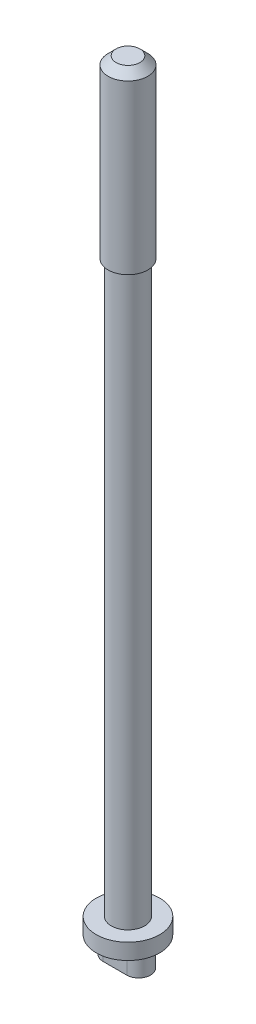
ISO-10303-21;
HEADER;
FILE_DESCRIPTION(('STEP AP214'),'2;1');
FILE_NAME('part.step','',(''),(''),'','','');
FILE_SCHEMA(('AUTOMOTIVE_DESIGN { 1 0 10303 214 1 1 1 1 }'));
ENDSEC;
DATA;
#1=APPLICATION_CONTEXT('core data for automotive mechanical design processes');
#2=APPLICATION_PROTOCOL_DEFINITION('international standard','automotive_design',2000,#1);
#3=PRODUCT_CONTEXT('',#1,'mechanical');
#4=PRODUCT('Part','Part','',(#3));
#5=PRODUCT_RELATED_PRODUCT_CATEGORY('part','',(#4));
#6=PRODUCT_DEFINITION_FORMATION('','',#4);
#7=PRODUCT_DEFINITION_CONTEXT('part definition',#1,'design');
#8=PRODUCT_DEFINITION('design','',#6,#7);
#9=PRODUCT_DEFINITION_SHAPE('','',#8);
#10=(LENGTH_UNIT() NAMED_UNIT(*) SI_UNIT(.MILLI.,.METRE.));
#11=(NAMED_UNIT(*) PLANE_ANGLE_UNIT() SI_UNIT($,.RADIAN.));
#12=(NAMED_UNIT(*) SI_UNIT($,.STERADIAN.) SOLID_ANGLE_UNIT());
#13=UNCERTAINTY_MEASURE_WITH_UNIT(LENGTH_MEASURE(1.E-05),#10,'distance_accuracy_value','');
#14=(GEOMETRIC_REPRESENTATION_CONTEXT(3) GLOBAL_UNCERTAINTY_ASSIGNED_CONTEXT((#13)) GLOBAL_UNIT_ASSIGNED_CONTEXT((#10,
#11,#12)) REPRESENTATION_CONTEXT('',''));
#15=CARTESIAN_POINT('',(0.,0.,0.));
#16=DIRECTION('',(0.,0.,1.));
#17=DIRECTION('',(1.,0.,0.));
#18=AXIS2_PLACEMENT_3D('',#15,#16,#17);
#19=CARTESIAN_POINT('',(-49.0306225105173,-89.7840104629929,0.));
#20=DIRECTION('',(0.,1.,0.));
#21=DIRECTION('',(0.,0.,1.));
#22=AXIS2_PLACEMENT_3D('',#19,#20,#21);
#23=PLANE('',#22);
#24=DIRECTION('',(1.,0.,0.));
#25=VECTOR('',#24,1.);
#26=CARTESIAN_POINT('',(-52.5566861266203,-89.7840104629929,1.50000000000001));
#27=LINE('',#26,#25);
#28=CARTESIAN_POINT('',(-52.5566861266203,-89.7840104629929,1.50000000000001));
#29=VERTEX_POINT('',#28);
#30=CARTESIAN_POINT('',(-49.5566861266203,-89.7840104629929,1.50000000000001));
#31=VERTEX_POINT('',#30);
#32=EDGE_CURVE('E58',#29,#31,#27,.T.);
#33=ORIENTED_EDGE('',*,*,#32,.F.);
#34=CARTESIAN_POINT('',(-52.5566861266203,-89.7840104629929,0.));
#35=DIRECTION('',(0.,-1.,0.));
#36=DIRECTION('',(0.,0.,-1.));
#37=AXIS2_PLACEMENT_3D('',#34,#35,#36);
#38=CIRCLE('',#37,1.5);
#39=CARTESIAN_POINT('',(-52.5566861266203,-89.7840104629929,-1.49999999999999));
#40=VERTEX_POINT('',#39);
#41=EDGE_CURVE('E21',#40,#29,#38,.F.);
#42=ORIENTED_EDGE('',*,*,#41,.F.);
#43=DIRECTION('',(-1.,0.,0.));
#44=VECTOR('',#43,1.);
#45=CARTESIAN_POINT('',(-49.5566861266203,-89.7840104629929,-1.49999999999999));
#46=LINE('',#45,#44);
#47=CARTESIAN_POINT('',(-49.5566861266203,-89.7840104629929,-1.49999999999999));
#48=VERTEX_POINT('',#47);
#49=EDGE_CURVE('E69',#48,#40,#46,.T.);
#50=ORIENTED_EDGE('',*,*,#49,.F.);
#51=CARTESIAN_POINT('',(-49.5566861266203,-89.7840104629929,0.));
#52=DIRECTION('',(0.,-1.,0.));
#53=DIRECTION('',(0.,0.,-1.));
#54=AXIS2_PLACEMENT_3D('',#51,#52,#53);
#55=CIRCLE('',#54,1.5);
#56=EDGE_CURVE('E60',#31,#48,#55,.F.);
#57=ORIENTED_EDGE('',*,*,#56,.F.);
#58=EDGE_LOOP('',(#33,#42,#50,#57));
#59=FACE_BOUND('',#58,.T.);
#60=ADVANCED_FACE('F17',(#59),#23,.F.);
#61=CARTESIAN_POINT('',(-49.5566861266203,-86.7840104629929,-1.49999999999999));
#62=DIRECTION('',(0.,0.,-1.));
#63=DIRECTION('',(-1.,0.,0.));
#64=AXIS2_PLACEMENT_3D('',#61,#62,#63);
#65=PLANE('',#64);
#66=DIRECTION('',(1.,0.,0.));
#67=VECTOR('',#66,1.);
#68=CARTESIAN_POINT('',(-52.9079596060044,-86.7840104629929,-1.49999999999999));
#69=LINE('',#68,#67);
#70=CARTESIAN_POINT('',(-49.5566861266203,-86.7840104629929,-1.49999999999999));
#71=VERTEX_POINT('',#70);
#72=CARTESIAN_POINT('',(-52.5566861266203,-86.7840104629929,-1.49999999999999));
#73=VERTEX_POINT('',#72);
#74=EDGE_CURVE('E100',#71,#73,#69,.F.);
#75=ORIENTED_EDGE('',*,*,#74,.F.);
#76=DIRECTION('',(0.,-1.,0.));
#77=VECTOR('',#76,1.);
#78=CARTESIAN_POINT('',(-49.5566861266203,-86.7840104629929,-1.49999999999999));
#79=LINE('',#78,#77);
#80=EDGE_CURVE('E75',#48,#71,#79,.F.);
#81=ORIENTED_EDGE('',*,*,#80,.F.);
#82=ORIENTED_EDGE('',*,*,#49,.T.);
#83=DIRECTION('',(0.,-1.,0.));
#84=VECTOR('',#83,1.);
#85=CARTESIAN_POINT('',(-52.5566861266203,-86.7840104629929,-1.49999999999999));
#86=LINE('',#85,#84);
#87=EDGE_CURVE('E63',#73,#40,#86,.T.);
#88=ORIENTED_EDGE('',*,*,#87,.F.);
#89=EDGE_LOOP('',(#75,#81,#82,#88));
#90=FACE_BOUND('',#89,.T.);
#91=ADVANCED_FACE('F207',(#90),#65,.T.);
#92=CARTESIAN_POINT('',(-52.5566861266203,-86.7840104629929,0.));
#93=DIRECTION('',(0.,-1.,0.));
#94=DIRECTION('',(0.,0.,-1.));
#95=AXIS2_PLACEMENT_3D('',#92,#93,#94);
#96=CYLINDRICAL_SURFACE('',#95,1.5);
#97=CARTESIAN_POINT('',(-52.5566861266203,-86.7840104629929,0.));
#98=DIRECTION('',(0.,-1.,0.));
#99=DIRECTION('',(0.,0.,-1.));
#100=AXIS2_PLACEMENT_3D('',#97,#98,#99);
#101=CIRCLE('',#100,1.5);
#102=CARTESIAN_POINT('',(-52.5566861266203,-86.7840104629929,1.50000000000001));
#103=VERTEX_POINT('',#102);
#104=EDGE_CURVE('E99',#73,#103,#101,.F.);
#105=ORIENTED_EDGE('',*,*,#104,.F.);
#106=ORIENTED_EDGE('',*,*,#87,.T.);
#107=ORIENTED_EDGE('',*,*,#41,.T.);
#108=DIRECTION('',(0.,1.,0.));
#109=VECTOR('',#108,1.);
#110=CARTESIAN_POINT('',(-52.5566861266203,-86.7840104629929,1.50000000000001));
#111=LINE('',#110,#109);
#112=EDGE_CURVE('E62',#103,#29,#111,.F.);
#113=ORIENTED_EDGE('',*,*,#112,.F.);
#114=EDGE_LOOP('',(#105,#106,#107,#113));
#115=FACE_BOUND('',#114,.T.);
#116=ADVANCED_FACE('F68',(#115),#96,.T.);
#117=CARTESIAN_POINT('',(-52.5566861266203,-86.7840104629929,1.50000000000001));
#118=DIRECTION('',(0.,0.,1.));
#119=DIRECTION('',(1.,0.,0.));
#120=AXIS2_PLACEMENT_3D('',#117,#118,#119);
#121=PLANE('',#120);
#122=DIRECTION('',(1.,0.,0.));
#123=VECTOR('',#122,1.);
#124=CARTESIAN_POINT('',(-52.9079596060044,-86.7840104629929,1.50000000000001));
#125=LINE('',#124,#123);
#126=CARTESIAN_POINT('',(-49.5566861266203,-86.7840104629929,1.50000000000001));
#127=VERTEX_POINT('',#126);
#128=EDGE_CURVE('E72',#103,#127,#125,.T.);
#129=ORIENTED_EDGE('',*,*,#128,.F.);
#130=ORIENTED_EDGE('',*,*,#112,.T.);
#131=ORIENTED_EDGE('',*,*,#32,.T.);
#132=DIRECTION('',(0.,-1.,0.));
#133=VECTOR('',#132,1.);
#134=CARTESIAN_POINT('',(-49.5566861266203,-86.7840104629929,1.50000000000001));
#135=LINE('',#134,#133);
#136=EDGE_CURVE('E36',#127,#31,#135,.T.);
#137=ORIENTED_EDGE('',*,*,#136,.F.);
#138=EDGE_LOOP('',(#129,#130,#131,#137));
#139=FACE_BOUND('',#138,.T.);
#140=ADVANCED_FACE('F70',(#139),#121,.T.);
#141=CARTESIAN_POINT('',(-49.5566861266203,-86.7840104629929,0.));
#142=DIRECTION('',(0.,-1.,0.));
#143=DIRECTION('',(0.,0.,-1.));
#144=AXIS2_PLACEMENT_3D('',#141,#142,#143);
#145=CYLINDRICAL_SURFACE('',#144,1.5);
#146=CARTESIAN_POINT('',(-49.5566861266203,-86.7840104629929,0.));
#147=DIRECTION('',(0.,-1.,0.));
#148=DIRECTION('',(0.,0.,-1.));
#149=AXIS2_PLACEMENT_3D('',#146,#147,#148);
#150=CIRCLE('',#149,1.5);
#151=EDGE_CURVE('E96',#127,#71,#150,.F.);
#152=ORIENTED_EDGE('',*,*,#151,.F.);
#153=ORIENTED_EDGE('',*,*,#136,.T.);
#154=ORIENTED_EDGE('',*,*,#56,.T.);
#155=ORIENTED_EDGE('',*,*,#80,.T.);
#156=EDGE_LOOP('',(#152,#153,#154,#155));
#157=FACE_BOUND('',#156,.T.);
#158=ADVANCED_FACE('F110',(#157),#145,.T.);
#159=CARTESIAN_POINT('',(-51.3401825869688,9.21598953700713,0.));
#160=DIRECTION('',(0.,1.,0.));
#161=DIRECTION('',(0.,0.,1.));
#162=AXIS2_PLACEMENT_3D('',#159,#160,#161);
#163=PLANE('',#162);
#164=CARTESIAN_POINT('',(-50.9079596060045,9.21598953691266,0.));
#165=DIRECTION('',(0.,-1.,0.));
#166=DIRECTION('',(0.,0.,-1.));
#167=AXIS2_PLACEMENT_3D('',#164,#165,#166);
#168=CIRCLE('',#167,1.50000000000355);
#169=CARTESIAN_POINT('',(-50.9079596060045,9.21598953691266,-1.50000000000355));
#170=VERTEX_POINT('',#169);
#171=EDGE_CURVE('E93',#170,#170,#168,.T.);
#172=ORIENTED_EDGE('',*,*,#171,.F.);
#173=EDGE_LOOP('',(#172));
#174=FACE_BOUND('',#173,.T.);
#175=ADVANCED_FACE('F115',(#174),#163,.T.);
#176=CARTESIAN_POINT('',(-52.9079596060044,-86.7840104629929,0.));
#177=DIRECTION('',(0.,-1.,0.));
#178=DIRECTION('',(1.,0.,0.));
#179=AXIS2_PLACEMENT_3D('',#176,#177,#178);
#180=PLANE('',#179);
#181=CARTESIAN_POINT('',(-50.9079596060044,-86.7840104629929,0.));
#182=DIRECTION('',(0.,1.,0.));
#183=DIRECTION('',(-1.,0.,0.));
#184=AXIS2_PLACEMENT_3D('',#181,#182,#183);
#185=CIRCLE('',#184,4.00000000000001);
#186=CARTESIAN_POINT('',(-54.9079596060045,-86.7840104629929,0.));
#187=VERTEX_POINT('',#186);
#188=EDGE_CURVE('E90',#187,#187,#185,.T.);
#189=ORIENTED_EDGE('',*,*,#188,.F.);
#190=EDGE_LOOP('',(#189));
#191=FACE_BOUND('',#190,.T.);
#192=ORIENTED_EDGE('',*,*,#128,.T.);
#193=ORIENTED_EDGE('',*,*,#151,.T.);
#194=ORIENTED_EDGE('',*,*,#74,.T.);
#195=ORIENTED_EDGE('',*,*,#104,.T.);
#196=EDGE_LOOP('',(#192,#193,#194,#195));
#197=FACE_BOUND('',#196,.T.);
#198=ADVANCED_FACE('F112',(#191,#197),#180,.T.);
#199=CARTESIAN_POINT('',(-50.9079596060045,8.21598953695002,0.));
#200=DIRECTION('',(0.,-1.,0.));
#201=DIRECTION('',(0.,0.,-1.));
#202=AXIS2_PLACEMENT_3D('',#199,#200,#201);
#203=CONICAL_SURFACE('',#202,2.50000000002304,0.78539816342587);
#204=CARTESIAN_POINT('',(-50.9079596060045,8.21598953700712,0.));
#205=DIRECTION('',(0.,1.,0.));
#206=DIRECTION('',(-1.,0.,0.));
#207=AXIS2_PLACEMENT_3D('',#204,#205,#206);
#208=CIRCLE('',#207,2.5);
#209=CARTESIAN_POINT('',(-53.4079596060045,8.21598953700712,0.));
#210=VERTEX_POINT('',#209);
#211=EDGE_CURVE('E89',#210,#210,#208,.F.);
#212=ORIENTED_EDGE('',*,*,#211,.F.);
#213=EDGE_LOOP('',(#212));
#214=FACE_BOUND('',#213,.T.);
#215=ORIENTED_EDGE('',*,*,#171,.T.);
#216=EDGE_LOOP('',(#215));
#217=FACE_BOUND('',#216,.T.);
#218=ADVANCED_FACE('F114',(#214,#217),#203,.T.);
#219=CARTESIAN_POINT('',(-50.9079596060044,-85.7840104629929,0.));
#220=DIRECTION('',(0.,1.,0.));
#221=DIRECTION('',(-1.,0.,0.));
#222=AXIS2_PLACEMENT_3D('',#219,#220,#221);
#223=CYLINDRICAL_SURFACE('',#222,4.00000000000001);
#224=CARTESIAN_POINT('',(-50.9079596060044,-84.7840104629929,0.));
#225=DIRECTION('',(0.,1.,0.));
#226=DIRECTION('',(-1.,0.,0.));
#227=AXIS2_PLACEMENT_3D('',#224,#225,#226);
#228=CIRCLE('',#227,4.00000000000001);
#229=CARTESIAN_POINT('',(-54.9079596060045,-84.7840104629929,0.));
#230=VERTEX_POINT('',#229);
#231=EDGE_CURVE('E86',#230,#230,#228,.T.);
#232=ORIENTED_EDGE('',*,*,#231,.F.);
#233=EDGE_LOOP('',(#232));
#234=FACE_BOUND('',#233,.T.);
#235=ORIENTED_EDGE('',*,*,#188,.T.);
#236=EDGE_LOOP('',(#235));
#237=FACE_BOUND('',#236,.T.);
#238=ADVANCED_FACE('F123',(#234,#237),#223,.T.);
#239=CARTESIAN_POINT('',(-50.9079596060045,-1.86239348955208,0.));
#240=DIRECTION('',(0.,1.,0.));
#241=DIRECTION('',(-1.,0.,0.));
#242=AXIS2_PLACEMENT_3D('',#239,#240,#241);
#243=CYLINDRICAL_SURFACE('',#242,2.5);
#244=ORIENTED_EDGE('',*,*,#211,.T.);
#245=EDGE_LOOP('',(#244));
#246=FACE_BOUND('',#245,.T.);
#247=CARTESIAN_POINT('',(-50.9079596060045,-12.9407765161113,0.));
#248=DIRECTION('',(0.,1.,0.));
#249=DIRECTION('',(-1.,0.,0.));
#250=AXIS2_PLACEMENT_3D('',#247,#248,#249);
#251=CIRCLE('',#250,2.5);
#252=CARTESIAN_POINT('',(-53.4079596060045,-12.9407765161113,0.));
#253=VERTEX_POINT('',#252);
#254=EDGE_CURVE('E83',#253,#253,#251,.F.);
#255=ORIENTED_EDGE('',*,*,#254,.F.);
#256=EDGE_LOOP('',(#255));
#257=FACE_BOUND('',#256,.T.);
#258=ADVANCED_FACE('F143',(#246,#257),#243,.T.);
#259=CARTESIAN_POINT('',(-53.9579596060045,-84.7840104629929,0.));
#260=DIRECTION('',(0.,1.,0.));
#261=DIRECTION('',(0.,0.,1.));
#262=AXIS2_PLACEMENT_3D('',#259,#260,#261);
#263=PLANE('',#262);
#264=ORIENTED_EDGE('',*,*,#231,.T.);
#265=EDGE_LOOP('',(#264));
#266=FACE_BOUND('',#265,.T.);
#267=CARTESIAN_POINT('',(-50.9079596060045,-84.7840104629929,0.));
#268=DIRECTION('',(0.,1.,0.));
#269=DIRECTION('',(-1.,0.,0.));
#270=AXIS2_PLACEMENT_3D('',#267,#268,#269);
#271=CIRCLE('',#270,2.10000000000001);
#272=CARTESIAN_POINT('',(-53.0079596060045,-84.7840104629929,0.));
#273=VERTEX_POINT('',#272);
#274=EDGE_CURVE('E27',#273,#273,#271,.T.);
#275=ORIENTED_EDGE('',*,*,#274,.F.);
#276=EDGE_LOOP('',(#275));
#277=FACE_BOUND('',#276,.T.);
#278=ADVANCED_FACE('F135',(#266,#277),#263,.T.);
#279=CARTESIAN_POINT('',(-53.2079596060045,-12.9407765161113,0.));
#280=DIRECTION('',(0.,-1.,0.));
#281=DIRECTION('',(1.,0.,0.));
#282=AXIS2_PLACEMENT_3D('',#279,#280,#281);
#283=PLANE('',#282);
#284=CARTESIAN_POINT('',(-50.9079596060045,-12.9407765161113,0.));
#285=DIRECTION('',(0.,1.,0.));
#286=DIRECTION('',(-1.,0.,0.));
#287=AXIS2_PLACEMENT_3D('',#284,#285,#286);
#288=CIRCLE('',#287,2.10000000000001);
#289=CARTESIAN_POINT('',(-53.0079596060045,-12.9407765161113,0.));
#290=VERTEX_POINT('',#289);
#291=EDGE_CURVE('E11',#290,#290,#288,.F.);
#292=ORIENTED_EDGE('',*,*,#291,.F.);
#293=EDGE_LOOP('',(#292));
#294=FACE_BOUND('',#293,.T.);
#295=ORIENTED_EDGE('',*,*,#254,.T.);
#296=EDGE_LOOP('',(#295));
#297=FACE_BOUND('',#296,.T.);
#298=ADVANCED_FACE('F130',(#294,#297),#283,.T.);
#299=CARTESIAN_POINT('',(-50.9079596060045,-48.8623934895521,0.));
#300=DIRECTION('',(0.,1.,0.));
#301=DIRECTION('',(-1.,0.,0.));
#302=AXIS2_PLACEMENT_3D('',#299,#300,#301);
#303=CYLINDRICAL_SURFACE('',#302,2.10000000000001);
#304=ORIENTED_EDGE('',*,*,#274,.T.);
#305=EDGE_LOOP('',(#304));
#306=FACE_BOUND('',#305,.T.);
#307=ORIENTED_EDGE('',*,*,#291,.T.);
#308=EDGE_LOOP('',(#307));
#309=FACE_BOUND('',#308,.T.);
#310=ADVANCED_FACE('F19',(#306,#309),#303,.T.);
#311=CLOSED_SHELL('',(#60,#91,#116,#140,#158,#175,#198,#218,#238,#258,#278,#298,#310));
#312=MANIFOLD_SOLID_BREP('B1',#311);
#313=ADVANCED_BREP_SHAPE_REPRESENTATION('',(#18,#312),#14);
#314=SHAPE_DEFINITION_REPRESENTATION(#9,#313);
ENDSEC;
END-ISO-10303-21;
